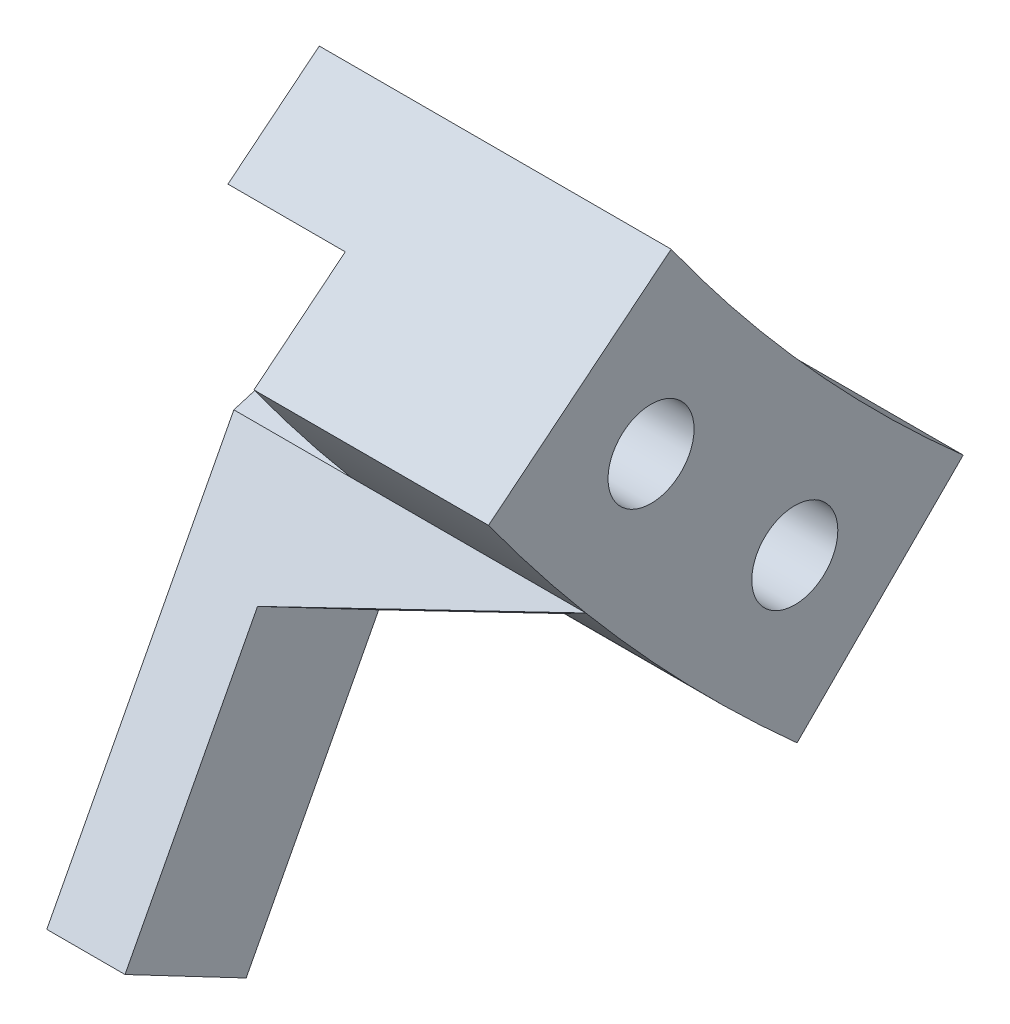
ISO-10303-21;
HEADER;
FILE_DESCRIPTION(('STEP AP214'),'2;1');
FILE_NAME('part.step','',(''),(''),'','','');
FILE_SCHEMA(('AUTOMOTIVE_DESIGN { 1 0 10303 214 1 1 1 1 }'));
ENDSEC;
DATA;
#1=APPLICATION_CONTEXT('core data for automotive mechanical design processes');
#2=APPLICATION_PROTOCOL_DEFINITION('international standard','automotive_design',2000,#1);
#3=PRODUCT_CONTEXT('',#1,'mechanical');
#4=PRODUCT('Part','Part','',(#3));
#5=PRODUCT_RELATED_PRODUCT_CATEGORY('part','',(#4));
#6=PRODUCT_DEFINITION_FORMATION('','',#4);
#7=PRODUCT_DEFINITION_CONTEXT('part definition',#1,'design');
#8=PRODUCT_DEFINITION('design','',#6,#7);
#9=PRODUCT_DEFINITION_SHAPE('','',#8);
#10=(LENGTH_UNIT() NAMED_UNIT(*) SI_UNIT(.MILLI.,.METRE.));
#11=(NAMED_UNIT(*) PLANE_ANGLE_UNIT() SI_UNIT($,.RADIAN.));
#12=(NAMED_UNIT(*) SI_UNIT($,.STERADIAN.) SOLID_ANGLE_UNIT());
#13=UNCERTAINTY_MEASURE_WITH_UNIT(LENGTH_MEASURE(1.E-05),#10,'distance_accuracy_value','');
#14=(GEOMETRIC_REPRESENTATION_CONTEXT(3) GLOBAL_UNCERTAINTY_ASSIGNED_CONTEXT((#13)) GLOBAL_UNIT_ASSIGNED_CONTEXT((#10,
#11,#12)) REPRESENTATION_CONTEXT('',''));
#15=CARTESIAN_POINT('',(0.,0.,0.));
#16=DIRECTION('',(0.,0.,1.));
#17=DIRECTION('',(1.,0.,0.));
#18=AXIS2_PLACEMENT_3D('',#15,#16,#17);
#19=CARTESIAN_POINT('',(9.,0.,0.));
#20=DIRECTION('',(-1.,0.,0.));
#21=DIRECTION('',(0.,0.,1.));
#22=AXIS2_PLACEMENT_3D('',#19,#20,#21);
#23=CYLINDRICAL_SURFACE('',#22,55.5);
#24=CARTESIAN_POINT('',(3.,0.,0.));
#25=DIRECTION('',(-1.,0.,0.));
#26=DIRECTION('',(0.,0.,1.));
#27=AXIS2_PLACEMENT_3D('',#24,#25,#26);
#28=CIRCLE('',#27,55.5);
#29=CARTESIAN_POINT('',(3.,-41.308371776399,37.0657310892798));
#30=VERTEX_POINT('',#29);
#31=CARTESIAN_POINT('',(3.,-38.5024405764329,39.9726415146442));
#32=VERTEX_POINT('',#31);
#33=EDGE_CURVE('E51',#30,#32,#28,.T.);
#34=ORIENTED_EDGE('',*,*,#33,.F.);
#35=DIRECTION('',(-1.,0.,0.));
#36=VECTOR('',#35,1.);
#37=CARTESIAN_POINT('',(9.,-41.308371776399,37.0657310892798));
#38=LINE('',#37,#36);
#39=CARTESIAN_POINT('',(9.,-41.308371776399,37.0657310892798));
#40=VERTEX_POINT('',#39);
#41=EDGE_CURVE('E165',#40,#30,#38,.T.);
#42=ORIENTED_EDGE('',*,*,#41,.F.);
#43=CARTESIAN_POINT('',(9.,0.,0.));
#44=DIRECTION('',(1.,0.,0.));
#45=DIRECTION('',(0.,0.,-1.));
#46=AXIS2_PLACEMENT_3D('',#43,#44,#45);
#47=CIRCLE('',#46,55.5);
#48=CARTESIAN_POINT('',(9.,-35.7290662565116,42.4697989686531));
#49=VERTEX_POINT('',#48);
#50=EDGE_CURVE('E250',#49,#40,#47,.T.);
#51=ORIENTED_EDGE('',*,*,#50,.F.);
#52=CARTESIAN_POINT('',(128.871806526806,0.,0.));
#53=DIRECTION('',(0.393919298579168,-0.813854070817419,0.427164064055968));
#54=DIRECTION('',(-0.919145030018058,-0.348794601778894,0.183070313166844));
#55=AXIS2_PLACEMENT_3D('',#52,#53,#54);
#56=ELLIPSE('',#55,140.891802458482,55.5);
#57=CARTESIAN_POINT('',(5.97799509234482,-38.5024405764329,39.9726415146442));
#58=VERTEX_POINT('',#57);
#59=EDGE_CURVE('E209',#49,#58,#56,.T.);
#60=ORIENTED_EDGE('',*,*,#59,.T.);
#61=DIRECTION('',(-1.,0.,0.));
#62=VECTOR('',#61,1.);
#63=CARTESIAN_POINT('',(2.,-38.5024405764329,39.9726415146442));
#64=LINE('',#63,#62);
#65=EDGE_CURVE('E168',#58,#32,#64,.T.);
#66=ORIENTED_EDGE('',*,*,#65,.T.);
#67=EDGE_LOOP('',(#34,#42,#51,#60,#66));
#68=FACE_BOUND('',#67,.T.);
#69=ADVANCED_FACE('F34',(#68),#23,.T.);
#70=CARTESIAN_POINT('',(3.,0.,0.));
#71=DIRECTION('',(-1.,0.,0.));
#72=DIRECTION('',(0.,0.,1.));
#73=AXIS2_PLACEMENT_3D('',#70,#71,#72);
#74=CIRCLE('',#73,55.5);
#75=CARTESIAN_POINT('',(3.,-35.7290662565116,42.469798968653));
#76=VERTEX_POINT('',#75);
#77=CARTESIAN_POINT('',(3.,-32.5447805142452,44.9565041042962));
#78=VERTEX_POINT('',#77);
#79=EDGE_CURVE('E314',#76,#78,#74,.T.);
#80=ORIENTED_EDGE('',*,*,#79,.F.);
#81=DIRECTION('',(-1.,0.,0.));
#82=VECTOR('',#81,1.);
#83=CARTESIAN_POINT('',(2.,-35.7290662565116,42.469798968653));
#84=LINE('',#83,#82);
#85=EDGE_CURVE('E232',#49,#76,#84,.T.);
#86=ORIENTED_EDGE('',*,*,#85,.F.);
#87=CARTESIAN_POINT('',(9.,-32.5447805142452,44.9565041042962));
#88=VERTEX_POINT('',#87);
#89=EDGE_CURVE('E251',#88,#49,#47,.T.);
#90=ORIENTED_EDGE('',*,*,#89,.F.);
#91=DIRECTION('',(-1.,0.,0.));
#92=VECTOR('',#91,1.);
#93=CARTESIAN_POINT('',(9.,-32.5447805142452,44.9565041042962));
#94=LINE('',#93,#92);
#95=EDGE_CURVE('E43',#88,#78,#94,.T.);
#96=ORIENTED_EDGE('',*,*,#95,.T.);
#97=EDGE_LOOP('',(#80,#86,#90,#96));
#98=FACE_BOUND('',#97,.T.);
#99=ADVANCED_FACE('F334',(#98),#23,.T.);
#100=CARTESIAN_POINT('',(9.,-33.0393205301164,40.800162976491));
#101=DIRECTION('',(-1.,0.,0.));
#102=DIRECTION('',(0.,0.,1.));
#103=AXIS2_PLACEMENT_3D('',#100,#101,#102);
#104=CYLINDRICAL_SURFACE('',#103,1.1);
#105=CARTESIAN_POINT('',(9.,-33.0393205301164,40.800162976491));
#106=DIRECTION('',(1.,0.,0.));
#107=DIRECTION('',(0.,0.,-1.));
#108=AXIS2_PLACEMENT_3D('',#105,#106,#107);
#109=CIRCLE('',#108,1.1);
#110=CARTESIAN_POINT('',(9.,-33.0393205301164,39.700162976491));
#111=VERTEX_POINT('',#110);
#112=EDGE_CURVE('E240',#111,#111,#109,.T.);
#113=ORIENTED_EDGE('',*,*,#112,.T.);
#114=EDGE_LOOP('',(#113));
#115=FACE_BOUND('',#114,.T.);
#116=CARTESIAN_POINT('',(3.,-33.0393205301164,40.800162976491));
#117=DIRECTION('',(-1.,0.,0.));
#118=DIRECTION('',(0.,0.,1.));
#119=AXIS2_PLACEMENT_3D('',#116,#117,#118);
#120=CIRCLE('',#119,1.1);
#121=CARTESIAN_POINT('',(3.,-33.0393205301164,41.900162976491));
#122=VERTEX_POINT('',#121);
#123=EDGE_CURVE('E38',#122,#122,#120,.T.);
#124=ORIENTED_EDGE('',*,*,#123,.T.);
#125=EDGE_LOOP('',(#124));
#126=FACE_BOUND('',#125,.T.);
#127=ADVANCED_FACE('F336',(#115,#126),#104,.F.);
#128=CARTESIAN_POINT('',(9.,-37.1231060122937,37.1231060122938));
#129=DIRECTION('',(-1.,0.,0.));
#130=DIRECTION('',(0.,0.,1.));
#131=AXIS2_PLACEMENT_3D('',#128,#129,#130);
#132=CYLINDRICAL_SURFACE('',#131,1.1);
#133=CARTESIAN_POINT('',(9.,-37.1231060122937,37.1231060122938));
#134=DIRECTION('',(1.,0.,0.));
#135=DIRECTION('',(0.,0.,-1.));
#136=AXIS2_PLACEMENT_3D('',#133,#134,#135);
#137=CIRCLE('',#136,1.1);
#138=CARTESIAN_POINT('',(9.,-37.1231060122937,36.0231060122938));
#139=VERTEX_POINT('',#138);
#140=EDGE_CURVE('E231',#139,#139,#137,.T.);
#141=ORIENTED_EDGE('',*,*,#140,.T.);
#142=EDGE_LOOP('',(#141));
#143=FACE_BOUND('',#142,.T.);
#144=CARTESIAN_POINT('',(3.,-37.1231060122937,37.1231060122938));
#145=DIRECTION('',(-1.,0.,0.));
#146=DIRECTION('',(0.,0.,1.));
#147=AXIS2_PLACEMENT_3D('',#144,#145,#146);
#148=CIRCLE('',#147,1.1);
#149=CARTESIAN_POINT('',(3.,-37.1231060122937,38.2231060122938));
#150=VERTEX_POINT('',#149);
#151=EDGE_CURVE('E181',#150,#150,#148,.T.);
#152=ORIENTED_EDGE('',*,*,#151,.T.);
#153=EDGE_LOOP('',(#152));
#154=FACE_BOUND('',#153,.T.);
#155=ADVANCED_FACE('F342',(#143,#154),#132,.F.);
#156=CARTESIAN_POINT('',(9.,0.,0.));
#157=DIRECTION('',(1.,0.,0.));
#158=DIRECTION('',(0.,0.,-1.));
#159=AXIS2_PLACEMENT_3D('',#156,#157,#158);
#160=PLANE('',#159);
#161=ORIENTED_EDGE('',*,*,#89,.T.);
#162=ORIENTED_EDGE('',*,*,#50,.T.);
#163=DIRECTION('',(0.,0.707106781186546,-0.707106781186549));
#164=VECTOR('',#163,1.);
#165=CARTESIAN_POINT('',(9.,-37.0587644401159,32.8161237529968));
#166=LINE('',#165,#164);
#167=CARTESIAN_POINT('',(9.,-37.0587644401159,32.8161237529968));
#168=VERTEX_POINT('',#167);
#169=EDGE_CURVE('E173',#40,#168,#166,.T.);
#170=ORIENTED_EDGE('',*,*,#169,.T.);
#171=CARTESIAN_POINT('',(9.,0.,0.));
#172=DIRECTION('',(-1.,0.,0.));
#173=DIRECTION('',(0.,0.,-1.));
#174=AXIS2_PLACEMENT_3D('',#171,#172,#173);
#175=CIRCLE('',#174,49.5);
#176=CARTESIAN_POINT('',(9.,-28.7626578959467,40.2859716372925));
#177=VERTEX_POINT('',#176);
#178=EDGE_CURVE('E244',#168,#177,#175,.T.);
#179=ORIENTED_EDGE('',*,*,#178,.T.);
#180=DIRECTION('',(0.,-0.629320391049836,0.777145961456972));
#181=VECTOR('',#180,1.);
#182=CARTESIAN_POINT('',(9.,-32.5447805142452,44.9565041042962));
#183=LINE('',#182,#181);
#184=EDGE_CURVE('E247',#177,#88,#183,.T.);
#185=ORIENTED_EDGE('',*,*,#184,.T.);
#186=EDGE_LOOP('',(#161,#162,#170,#179,#185));
#187=FACE_BOUND('',#186,.T.);
#188=ORIENTED_EDGE('',*,*,#112,.F.);
#189=EDGE_LOOP('',(#188));
#190=FACE_BOUND('',#189,.T.);
#191=ORIENTED_EDGE('',*,*,#140,.F.);
#192=EDGE_LOOP('',(#191));
#193=FACE_BOUND('',#192,.T.);
#194=ADVANCED_FACE('F277',(#187,#190,#193),#160,.T.);
#195=CARTESIAN_POINT('',(0.,0.,0.));
#196=DIRECTION('',(1.,0.,0.));
#197=DIRECTION('',(0.,0.,-1.));
#198=AXIS2_PLACEMENT_3D('',#195,#196,#197);
#199=PLANE('',#198);
#200=DIRECTION('',(0.,0.707106781186546,-0.707106781186549));
#201=VECTOR('',#200,1.);
#202=CARTESIAN_POINT('',(0.,-37.0587644401159,32.8161237529968));
#203=LINE('',#202,#201);
#204=CARTESIAN_POINT('',(0.,-39.1835681082574,34.9409274211383));
#205=VERTEX_POINT('',#204);
#206=CARTESIAN_POINT('',(0.,-37.0587644401159,32.8161237529968));
#207=VERTEX_POINT('',#206);
#208=EDGE_CURVE('E248',#205,#207,#203,.T.);
#209=ORIENTED_EDGE('',*,*,#208,.F.);
#210=DIRECTION('',(0.,-0.999205597903789,-0.0398518897636068));
#211=VECTOR('',#210,1.);
#212=CARTESIAN_POINT('',(0.,-39.1835681082574,34.9409274211383));
#213=LINE('',#212,#211);
#214=CARTESIAN_POINT('',(0.,-37.1231060122937,35.0231060122938));
#215=VERTEX_POINT('',#214);
#216=EDGE_CURVE('E159',#215,#205,#213,.T.);
#217=ORIENTED_EDGE('',*,*,#216,.F.);
#218=CARTESIAN_POINT('',(0.,-37.1231060122937,37.1231060122938));
#219=DIRECTION('',(-1.,0.,0.));
#220=DIRECTION('',(0.,0.,1.));
#221=AXIS2_PLACEMENT_3D('',#218,#219,#220);
#222=CIRCLE('',#221,2.1);
#223=CARTESIAN_POINT('',(0.,-36.3155551192554,39.0616264674743));
#224=VERTEX_POINT('',#223);
#225=EDGE_CURVE('E530',#224,#215,#222,.T.);
#226=ORIENTED_EDGE('',*,*,#225,.F.);
#227=DIRECTION('',(0.,0.923104978657367,-0.384548044303937));
#228=VECTOR('',#227,1.);
#229=CARTESIAN_POINT('',(0.,-36.3155551192554,39.0616264674743));
#230=LINE('',#229,#228);
#231=CARTESIAN_POINT('',(0.,-38.5024405764329,39.9726415146442));
#232=VERTEX_POINT('',#231);
#233=EDGE_CURVE('E532',#232,#224,#230,.T.);
#234=ORIENTED_EDGE('',*,*,#233,.F.);
#235=DIRECTION('',(0.,-0.885446849232737,0.46474065583271));
#236=VECTOR('',#235,1.);
#237=CARTESIAN_POINT('',(0.,-46.4714622195275,44.1553074171386));
#238=LINE('',#237,#236);
#239=CARTESIAN_POINT('',(0.,-46.4714622195275,44.1553074171386));
#240=VERTEX_POINT('',#239);
#241=EDGE_CURVE('E212',#232,#240,#238,.T.);
#242=ORIENTED_EDGE('',*,*,#241,.T.);
#243=DIRECTION('',(0.,0.464740655832709,0.885446849232738));
#244=VECTOR('',#243,1.);
#245=CARTESIAN_POINT('',(0.,-44.844869924113,47.2543713894531));
#246=LINE('',#245,#244);
#247=CARTESIAN_POINT('',(0.,-44.844869924113,47.2543713894531));
#248=VERTEX_POINT('',#247);
#249=EDGE_CURVE('E225',#240,#248,#246,.T.);
#250=ORIENTED_EDGE('',*,*,#249,.T.);
#251=DIRECTION('',(0.,0.885446849232738,-0.46474065583271));
#252=VECTOR('',#251,1.);
#253=CARTESIAN_POINT('',(0.,-35.7290662565116,42.469798968653));
#254=LINE('',#253,#252);
#255=CARTESIAN_POINT('',(0.,-35.7290662565116,42.469798968653));
#256=VERTEX_POINT('',#255);
#257=EDGE_CURVE('E216',#248,#256,#254,.T.);
#258=ORIENTED_EDGE('',*,*,#257,.T.);
#259=DIRECTION('',(0.,-0.285950705027522,0.958244329121891));
#260=VECTOR('',#259,1.);
#261=CARTESIAN_POINT('',(0.,-35.7290662565116,42.469798968653));
#262=LINE('',#261,#260);
#263=CARTESIAN_POINT('',(0.,-35.0516336212724,40.1996664959332));
#264=VERTEX_POINT('',#263);
#265=EDGE_CURVE('E321',#264,#256,#262,.T.);
#266=ORIENTED_EDGE('',*,*,#265,.F.);
#267=CARTESIAN_POINT('',(0.,-33.0393205301164,40.800162976491));
#268=DIRECTION('',(-1.,0.,0.));
#269=DIRECTION('',(0.,0.,1.));
#270=AXIS2_PLACEMENT_3D('',#267,#268,#269);
#271=CIRCLE('',#270,2.1);
#272=CARTESIAN_POINT('',(0.,-30.9393205301164,40.800162976491));
#273=VERTEX_POINT('',#272);
#274=EDGE_CURVE('E320',#273,#264,#271,.T.);
#275=ORIENTED_EDGE('',*,*,#274,.F.);
#276=DIRECTION('',(0.,-0.15493733397992,-0.987924300004406));
#277=VECTOR('',#276,1.);
#278=CARTESIAN_POINT('',(0.,-30.9393205301164,40.800162976491));
#279=LINE('',#278,#277);
#280=CARTESIAN_POINT('',(0.,-30.653719205096,42.6212378707943));
#281=VERTEX_POINT('',#280);
#282=EDGE_CURVE('E196',#281,#273,#279,.T.);
#283=ORIENTED_EDGE('',*,*,#282,.F.);
#284=DIRECTION('',(0.,-0.629320391049836,0.777145961456972));
#285=VECTOR('',#284,1.);
#286=CARTESIAN_POINT('',(0.,-32.5447805142452,44.9565041042962));
#287=LINE('',#286,#285);
#288=CARTESIAN_POINT('',(0.,-28.7626578959467,40.2859716372925));
#289=VERTEX_POINT('',#288);
#290=EDGE_CURVE('E257',#289,#281,#287,.T.);
#291=ORIENTED_EDGE('',*,*,#290,.F.);
#292=CARTESIAN_POINT('',(0.,0.,0.));
#293=DIRECTION('',(-1.,0.,0.));
#294=DIRECTION('',(0.,0.,-1.));
#295=AXIS2_PLACEMENT_3D('',#292,#293,#294);
#296=CIRCLE('',#295,49.5);
#297=EDGE_CURVE('E243',#207,#289,#296,.T.);
#298=ORIENTED_EDGE('',*,*,#297,.F.);
#299=EDGE_LOOP('',(#209,#217,#226,#234,#242,#250,#258,#266,#275,#283,#291,#298));
#300=FACE_BOUND('',#299,.T.);
#301=ADVANCED_FACE('F267',(#300),#199,.F.);
#302=CARTESIAN_POINT('',(9.,0.,0.));
#303=DIRECTION('',(-1.,0.,0.));
#304=DIRECTION('',(0.,0.,1.));
#305=AXIS2_PLACEMENT_3D('',#302,#303,#304);
#306=CYLINDRICAL_SURFACE('',#305,49.5);
#307=ORIENTED_EDGE('',*,*,#297,.T.);
#308=DIRECTION('',(-1.,0.,0.));
#309=VECTOR('',#308,1.);
#310=CARTESIAN_POINT('',(9.,-28.7626578959467,40.2859716372925));
#311=LINE('',#310,#309);
#312=EDGE_CURVE('E11',#177,#289,#311,.T.);
#313=ORIENTED_EDGE('',*,*,#312,.F.);
#314=ORIENTED_EDGE('',*,*,#178,.F.);
#315=DIRECTION('',(-1.,0.,0.));
#316=VECTOR('',#315,1.);
#317=CARTESIAN_POINT('',(9.,-37.0587644401159,32.8161237529968));
#318=LINE('',#317,#316);
#319=EDGE_CURVE('E174',#168,#207,#318,.T.);
#320=ORIENTED_EDGE('',*,*,#319,.T.);
#321=EDGE_LOOP('',(#307,#313,#314,#320));
#322=FACE_BOUND('',#321,.T.);
#323=ADVANCED_FACE('F36',(#322),#306,.F.);
#324=CARTESIAN_POINT('',(9.,-32.5447805142452,44.9565041042962));
#325=DIRECTION('',(0.,-0.777145961456972,-0.629320391049836));
#326=DIRECTION('',(0.,0.629320391049836,-0.777145961456972));
#327=AXIS2_PLACEMENT_3D('',#324,#325,#326);
#328=PLANE('',#327);
#329=ORIENTED_EDGE('',*,*,#290,.T.);
#330=DIRECTION('',(-1.,0.,0.));
#331=VECTOR('',#330,1.);
#332=CARTESIAN_POINT('',(3.,-30.653719205096,42.6212378707943));
#333=LINE('',#332,#331);
#334=CARTESIAN_POINT('',(3.,-30.653719205096,42.6212378707943));
#335=VERTEX_POINT('',#334);
#336=EDGE_CURVE('E187',#335,#281,#333,.T.);
#337=ORIENTED_EDGE('',*,*,#336,.F.);
#338=DIRECTION('',(0.,0.629320391049837,-0.777145961456972));
#339=VECTOR('',#338,1.);
#340=CARTESIAN_POINT('',(3.,-30.653719205096,42.6212378707943));
#341=LINE('',#340,#339);
#342=EDGE_CURVE('E316',#78,#335,#341,.T.);
#343=ORIENTED_EDGE('',*,*,#342,.F.);
#344=ORIENTED_EDGE('',*,*,#95,.F.);
#345=ORIENTED_EDGE('',*,*,#184,.F.);
#346=ORIENTED_EDGE('',*,*,#312,.T.);
#347=EDGE_LOOP('',(#329,#337,#343,#344,#345,#346));
#348=FACE_BOUND('',#347,.T.);
#349=ADVANCED_FACE('F272',(#348),#328,.F.);
#350=CARTESIAN_POINT('',(9.,-37.0587644401159,32.8161237529968));
#351=DIRECTION('',(0.,0.707106781186549,0.707106781186546));
#352=DIRECTION('',(0.,-0.707106781186546,0.707106781186549));
#353=AXIS2_PLACEMENT_3D('',#350,#351,#352);
#354=PLANE('',#353);
#355=DIRECTION('',(0.,-0.707106781186544,0.707106781186551));
#356=VECTOR('',#355,1.);
#357=CARTESIAN_POINT('',(3.,-41.308371776399,37.0657310892798));
#358=LINE('',#357,#356);
#359=CARTESIAN_POINT('',(3.,-39.1835681082574,34.9409274211383));
#360=VERTEX_POINT('',#359);
#361=EDGE_CURVE('E151',#360,#30,#358,.T.);
#362=ORIENTED_EDGE('',*,*,#361,.F.);
#363=DIRECTION('',(-1.,0.,0.));
#364=VECTOR('',#363,1.);
#365=CARTESIAN_POINT('',(3.,-39.1835681082574,34.9409274211383));
#366=LINE('',#365,#364);
#367=EDGE_CURVE('E261',#360,#205,#366,.T.);
#368=ORIENTED_EDGE('',*,*,#367,.T.);
#369=ORIENTED_EDGE('',*,*,#208,.T.);
#370=ORIENTED_EDGE('',*,*,#319,.F.);
#371=ORIENTED_EDGE('',*,*,#169,.F.);
#372=ORIENTED_EDGE('',*,*,#41,.T.);
#373=EDGE_LOOP('',(#362,#368,#369,#370,#371,#372));
#374=FACE_BOUND('',#373,.T.);
#375=ADVANCED_FACE('F171',(#374),#354,.F.);
#376=CARTESIAN_POINT('',(2.,-46.4714622195275,44.1553074171386));
#377=DIRECTION('',(0.,-0.46474065583271,-0.885446849232738));
#378=DIRECTION('',(0.,0.885446849232738,-0.46474065583271));
#379=AXIS2_PLACEMENT_3D('',#376,#377,#378);
#380=PLANE('',#379);
#381=ORIENTED_EDGE('',*,*,#241,.F.);
#382=DIRECTION('',(-1.,0.,0.));
#383=VECTOR('',#382,1.);
#384=CARTESIAN_POINT('',(3.,-38.5024405764329,39.9726415146442));
#385=LINE('',#384,#383);
#386=EDGE_CURVE('E296',#32,#232,#385,.T.);
#387=ORIENTED_EDGE('',*,*,#386,.F.);
#388=ORIENTED_EDGE('',*,*,#65,.F.);
#389=DIRECTION('',(0.919145030018058,0.348794601778894,-0.183070313166844));
#390=VECTOR('',#389,1.);
#391=CARTESIAN_POINT('',(2.,-40.0119990996243,40.7649569638366));
#392=LINE('',#391,#390);
#393=CARTESIAN_POINT('',(2.,-40.0119990996243,40.7649569638366));
#394=VERTEX_POINT('',#393);
#395=EDGE_CURVE('E206',#394,#58,#392,.T.);
#396=ORIENTED_EDGE('',*,*,#395,.F.);
#397=DIRECTION('',(0.,-0.885446849232737,0.46474065583271));
#398=VECTOR('',#397,1.);
#399=CARTESIAN_POINT('',(2.,-46.4714622195275,44.1553074171386));
#400=LINE('',#399,#398);
#401=CARTESIAN_POINT('',(2.,-46.4714622195275,44.1553074171386));
#402=VERTEX_POINT('',#401);
#403=EDGE_CURVE('E213',#394,#402,#400,.T.);
#404=ORIENTED_EDGE('',*,*,#403,.T.);
#405=DIRECTION('',(-1.,0.,0.));
#406=VECTOR('',#405,1.);
#407=CARTESIAN_POINT('',(2.,-46.4714622195275,44.1553074171386));
#408=LINE('',#407,#406);
#409=EDGE_CURVE('E222',#402,#240,#408,.T.);
#410=ORIENTED_EDGE('',*,*,#409,.T.);
#411=EDGE_LOOP('',(#381,#387,#388,#396,#404,#410));
#412=FACE_BOUND('',#411,.T.);
#413=ADVANCED_FACE('F294',(#412),#380,.T.);
#414=CARTESIAN_POINT('',(2.,-35.7290662565116,42.469798968653));
#415=DIRECTION('',(0.,0.46474065583271,0.885446849232738));
#416=DIRECTION('',(0.,-0.885446849232738,0.46474065583271));
#417=AXIS2_PLACEMENT_3D('',#414,#415,#416);
#418=PLANE('',#417);
#419=ORIENTED_EDGE('',*,*,#257,.F.);
#420=DIRECTION('',(-1.,0.,0.));
#421=VECTOR('',#420,1.);
#422=CARTESIAN_POINT('',(2.,-44.844869924113,47.2543713894531));
#423=LINE('',#422,#421);
#424=CARTESIAN_POINT('',(2.,-44.844869924113,47.2543713894531));
#425=VERTEX_POINT('',#424);
#426=EDGE_CURVE('E235',#425,#248,#423,.T.);
#427=ORIENTED_EDGE('',*,*,#426,.F.);
#428=DIRECTION('',(0.,0.885446849232738,-0.46474065583271));
#429=VECTOR('',#428,1.);
#430=CARTESIAN_POINT('',(2.,-35.7290662565116,42.469798968653));
#431=LINE('',#430,#429);
#432=CARTESIAN_POINT('',(2.,-38.3854068042098,43.8640209361512));
#433=VERTEX_POINT('',#432);
#434=EDGE_CURVE('E219',#425,#433,#431,.T.);
#435=ORIENTED_EDGE('',*,*,#434,.T.);
#436=DIRECTION('',(0.919145030018058,0.348794601778894,-0.183070313166844));
#437=VECTOR('',#436,1.);
#438=CARTESIAN_POINT('',(2.,-38.3854068042098,43.8640209361512));
#439=LINE('',#438,#437);
#440=EDGE_CURVE('E59',#433,#49,#439,.T.);
#441=ORIENTED_EDGE('',*,*,#440,.T.);
#442=ORIENTED_EDGE('',*,*,#85,.T.);
#443=DIRECTION('',(-1.,0.,0.));
#444=VECTOR('',#443,1.);
#445=CARTESIAN_POINT('',(3.,-35.7290662565116,42.469798968653));
#446=LINE('',#445,#444);
#447=EDGE_CURVE('E193',#76,#256,#446,.T.);
#448=ORIENTED_EDGE('',*,*,#447,.T.);
#449=EDGE_LOOP('',(#419,#427,#435,#441,#442,#448));
#450=FACE_BOUND('',#449,.T.);
#451=ADVANCED_FACE('F282',(#450),#418,.T.);
#452=CARTESIAN_POINT('',(2.,-44.844869924113,47.2543713894531));
#453=DIRECTION('',(0.,-0.885446849232738,0.464740655832709));
#454=DIRECTION('',(0.,-0.464740655832709,-0.885446849232738));
#455=AXIS2_PLACEMENT_3D('',#452,#453,#454);
#456=PLANE('',#455);
#457=ORIENTED_EDGE('',*,*,#249,.F.);
#458=ORIENTED_EDGE('',*,*,#409,.F.);
#459=DIRECTION('',(0.,0.464740655832709,0.885446849232738));
#460=VECTOR('',#459,1.);
#461=CARTESIAN_POINT('',(2.,-44.844869924113,47.2543713894531));
#462=LINE('',#461,#460);
#463=EDGE_CURVE('E215',#402,#425,#462,.T.);
#464=ORIENTED_EDGE('',*,*,#463,.T.);
#465=ORIENTED_EDGE('',*,*,#426,.T.);
#466=EDGE_LOOP('',(#457,#458,#464,#465));
#467=FACE_BOUND('',#466,.T.);
#468=ADVANCED_FACE('F291',(#467),#456,.T.);
#469=CARTESIAN_POINT('',(2.,0.,0.));
#470=DIRECTION('',(-1.,0.,0.));
#471=DIRECTION('',(0.,0.,1.));
#472=AXIS2_PLACEMENT_3D('',#469,#470,#471);
#473=PLANE('',#472);
#474=ORIENTED_EDGE('',*,*,#403,.F.);
#475=DIRECTION('',(0.,0.46474065583271,0.885446849232738));
#476=VECTOR('',#475,1.);
#477=CARTESIAN_POINT('',(2.,-43.5513584875166,34.021594662778));
#478=LINE('',#477,#476);
#479=EDGE_CURVE('E205',#394,#433,#478,.T.);
#480=ORIENTED_EDGE('',*,*,#479,.T.);
#481=ORIENTED_EDGE('',*,*,#434,.F.);
#482=ORIENTED_EDGE('',*,*,#463,.F.);
#483=EDGE_LOOP('',(#474,#480,#481,#482));
#484=FACE_BOUND('',#483,.T.);
#485=ADVANCED_FACE('F287',(#484),#473,.F.);
#486=CARTESIAN_POINT('',(2.,-43.5513584875166,34.021594662778));
#487=DIRECTION('',(0.393919298579168,-0.813854070817419,0.427164064055968));
#488=DIRECTION('',(0.,-0.46474065583271,-0.885446849232738));
#489=AXIS2_PLACEMENT_3D('',#486,#487,#488);
#490=PLANE('',#489);
#491=ORIENTED_EDGE('',*,*,#59,.F.);
#492=ORIENTED_EDGE('',*,*,#440,.F.);
#493=ORIENTED_EDGE('',*,*,#479,.F.);
#494=ORIENTED_EDGE('',*,*,#395,.T.);
#495=EDGE_LOOP('',(#491,#492,#493,#494));
#496=FACE_BOUND('',#495,.T.);
#497=ADVANCED_FACE('F279',(#496),#490,.T.);
#498=CARTESIAN_POINT('',(3.,-33.0393205301164,40.800162976491));
#499=DIRECTION('',(-1.,0.,0.));
#500=DIRECTION('',(0.,0.,1.));
#501=AXIS2_PLACEMENT_3D('',#498,#499,#500);
#502=CYLINDRICAL_SURFACE('',#501,2.1);
#503=ORIENTED_EDGE('',*,*,#274,.T.);
#504=DIRECTION('',(-1.,0.,0.));
#505=VECTOR('',#504,1.);
#506=CARTESIAN_POINT('',(3.,-35.0516336212724,40.1996664959332));
#507=LINE('',#506,#505);
#508=CARTESIAN_POINT('',(3.,-35.0516336212724,40.1996664959332));
#509=VERTEX_POINT('',#508);
#510=EDGE_CURVE('E201',#509,#264,#507,.T.);
#511=ORIENTED_EDGE('',*,*,#510,.F.);
#512=CARTESIAN_POINT('',(3.,-33.0393205301164,40.800162976491));
#513=DIRECTION('',(-1.,0.,0.));
#514=DIRECTION('',(0.,0.,1.));
#515=AXIS2_PLACEMENT_3D('',#512,#513,#514);
#516=CIRCLE('',#515,2.1);
#517=CARTESIAN_POINT('',(3.,-30.9393205301164,40.800162976491));
#518=VERTEX_POINT('',#517);
#519=EDGE_CURVE('E308',#518,#509,#516,.T.);
#520=ORIENTED_EDGE('',*,*,#519,.F.);
#521=DIRECTION('',(-1.,0.,0.));
#522=VECTOR('',#521,1.);
#523=CARTESIAN_POINT('',(3.,-30.9393205301164,40.800162976491));
#524=LINE('',#523,#522);
#525=EDGE_CURVE('E183',#518,#273,#524,.T.);
#526=ORIENTED_EDGE('',*,*,#525,.T.);
#527=EDGE_LOOP('',(#503,#511,#520,#526));
#528=FACE_BOUND('',#527,.T.);
#529=ADVANCED_FACE('F327',(#528),#502,.F.);
#530=CARTESIAN_POINT('',(3.,-30.9393205301164,40.800162976491));
#531=DIRECTION('',(0.,0.987924300004405,-0.15493733397992));
#532=DIRECTION('',(0.,0.15493733397992,0.987924300004406));
#533=AXIS2_PLACEMENT_3D('',#530,#531,#532);
#534=PLANE('',#533);
#535=ORIENTED_EDGE('',*,*,#282,.T.);
#536=ORIENTED_EDGE('',*,*,#525,.F.);
#537=DIRECTION('',(0.,-0.15493733397992,-0.987924300004406));
#538=VECTOR('',#537,1.);
#539=CARTESIAN_POINT('',(3.,-30.9393205301164,40.800162976491));
#540=LINE('',#539,#538);
#541=EDGE_CURVE('E203',#335,#518,#540,.T.);
#542=ORIENTED_EDGE('',*,*,#541,.F.);
#543=ORIENTED_EDGE('',*,*,#336,.T.);
#544=EDGE_LOOP('',(#535,#536,#542,#543));
#545=FACE_BOUND('',#544,.T.);
#546=ADVANCED_FACE('F325',(#545),#534,.F.);
#547=CARTESIAN_POINT('',(3.,-35.7290662565116,42.469798968653));
#548=DIRECTION('',(0.,-0.958244329121891,-0.285950705027522));
#549=DIRECTION('',(0.,0.285950705027522,-0.958244329121891));
#550=AXIS2_PLACEMENT_3D('',#547,#548,#549);
#551=PLANE('',#550);
#552=ORIENTED_EDGE('',*,*,#265,.T.);
#553=ORIENTED_EDGE('',*,*,#447,.F.);
#554=DIRECTION('',(0.,-0.285950705027522,0.958244329121891));
#555=VECTOR('',#554,1.);
#556=CARTESIAN_POINT('',(3.,-35.7290662565116,42.469798968653));
#557=LINE('',#556,#555);
#558=EDGE_CURVE('E311',#509,#76,#557,.T.);
#559=ORIENTED_EDGE('',*,*,#558,.F.);
#560=ORIENTED_EDGE('',*,*,#510,.T.);
#561=EDGE_LOOP('',(#552,#553,#559,#560));
#562=FACE_BOUND('',#561,.T.);
#563=ADVANCED_FACE('F329',(#562),#551,.F.);
#564=CARTESIAN_POINT('',(3.,-33.0393205301164,40.800162976491));
#565=DIRECTION('',(-1.,0.,0.));
#566=DIRECTION('',(0.,0.,1.));
#567=AXIS2_PLACEMENT_3D('',#564,#565,#566);
#568=PLANE('',#567);
#569=ORIENTED_EDGE('',*,*,#123,.F.);
#570=EDGE_LOOP('',(#569));
#571=FACE_BOUND('',#570,.T.);
#572=ORIENTED_EDGE('',*,*,#519,.T.);
#573=ORIENTED_EDGE('',*,*,#558,.T.);
#574=ORIENTED_EDGE('',*,*,#79,.T.);
#575=ORIENTED_EDGE('',*,*,#342,.T.);
#576=ORIENTED_EDGE('',*,*,#541,.T.);
#577=EDGE_LOOP('',(#572,#573,#574,#575,#576));
#578=FACE_BOUND('',#577,.T.);
#579=ADVANCED_FACE('F332',(#571,#578),#568,.T.);
#580=CARTESIAN_POINT('',(3.,-39.1835681082574,34.9409274211383));
#581=DIRECTION('',(0.,0.0398518897636068,-0.999205597903789));
#582=DIRECTION('',(0.,0.99920559790379,0.0398518897636068));
#583=AXIS2_PLACEMENT_3D('',#580,#581,#582);
#584=PLANE('',#583);
#585=ORIENTED_EDGE('',*,*,#216,.T.);
#586=ORIENTED_EDGE('',*,*,#367,.F.);
#587=DIRECTION('',(0.,-0.999205597903789,-0.0398518897636068));
#588=VECTOR('',#587,1.);
#589=CARTESIAN_POINT('',(3.,-39.1835681082574,34.9409274211383));
#590=LINE('',#589,#588);
#591=CARTESIAN_POINT('',(3.,-37.1231060122937,35.0231060122938));
#592=VERTEX_POINT('',#591);
#593=EDGE_CURVE('E155',#592,#360,#590,.T.);
#594=ORIENTED_EDGE('',*,*,#593,.F.);
#595=DIRECTION('',(-1.,0.,0.));
#596=VECTOR('',#595,1.);
#597=CARTESIAN_POINT('',(3.,-37.1231060122937,35.0231060122938));
#598=LINE('',#597,#596);
#599=EDGE_CURVE('E302',#592,#215,#598,.T.);
#600=ORIENTED_EDGE('',*,*,#599,.T.);
#601=EDGE_LOOP('',(#585,#586,#594,#600));
#602=FACE_BOUND('',#601,.T.);
#603=ADVANCED_FACE('F381',(#602),#584,.F.);
#604=CARTESIAN_POINT('',(3.,-37.1231060122937,37.1231060122938));
#605=DIRECTION('',(-1.,0.,0.));
#606=DIRECTION('',(0.,0.,1.));
#607=AXIS2_PLACEMENT_3D('',#604,#605,#606);
#608=CYLINDRICAL_SURFACE('',#607,2.1);
#609=ORIENTED_EDGE('',*,*,#225,.T.);
#610=ORIENTED_EDGE('',*,*,#599,.F.);
#611=CARTESIAN_POINT('',(3.,-37.1231060122937,37.1231060122938));
#612=DIRECTION('',(-1.,0.,0.));
#613=DIRECTION('',(0.,0.,1.));
#614=AXIS2_PLACEMENT_3D('',#611,#612,#613);
#615=CIRCLE('',#614,2.1);
#616=CARTESIAN_POINT('',(3.,-36.3155551192554,39.0616264674743));
#617=VERTEX_POINT('',#616);
#618=EDGE_CURVE('E304',#617,#592,#615,.T.);
#619=ORIENTED_EDGE('',*,*,#618,.F.);
#620=DIRECTION('',(-1.,0.,0.));
#621=VECTOR('',#620,1.);
#622=CARTESIAN_POINT('',(3.,-36.3155551192554,39.0616264674743));
#623=LINE('',#622,#621);
#624=EDGE_CURVE('E300',#617,#224,#623,.T.);
#625=ORIENTED_EDGE('',*,*,#624,.T.);
#626=EDGE_LOOP('',(#609,#610,#619,#625));
#627=FACE_BOUND('',#626,.T.);
#628=ADVANCED_FACE('F386',(#627),#608,.F.);
#629=CARTESIAN_POINT('',(3.,-36.3155551192554,39.0616264674743));
#630=DIRECTION('',(0.,0.384548044303937,0.923104978657367));
#631=DIRECTION('',(0.,-0.923104978657367,0.384548044303937));
#632=AXIS2_PLACEMENT_3D('',#629,#630,#631);
#633=PLANE('',#632);
#634=ORIENTED_EDGE('',*,*,#233,.T.);
#635=ORIENTED_EDGE('',*,*,#624,.F.);
#636=DIRECTION('',(0.,0.923104978657367,-0.384548044303937));
#637=VECTOR('',#636,1.);
#638=CARTESIAN_POINT('',(3.,-36.3155551192554,39.0616264674743));
#639=LINE('',#638,#637);
#640=EDGE_CURVE('E169',#32,#617,#639,.T.);
#641=ORIENTED_EDGE('',*,*,#640,.F.);
#642=ORIENTED_EDGE('',*,*,#386,.T.);
#643=EDGE_LOOP('',(#634,#635,#641,#642));
#644=FACE_BOUND('',#643,.T.);
#645=ADVANCED_FACE('F383',(#644),#633,.F.);
#646=CARTESIAN_POINT('',(3.,-37.1231060122937,37.1231060122938));
#647=DIRECTION('',(-1.,0.,0.));
#648=DIRECTION('',(0.,0.,1.));
#649=AXIS2_PLACEMENT_3D('',#646,#647,#648);
#650=PLANE('',#649);
#651=ORIENTED_EDGE('',*,*,#151,.F.);
#652=EDGE_LOOP('',(#651));
#653=FACE_BOUND('',#652,.T.);
#654=ORIENTED_EDGE('',*,*,#361,.T.);
#655=ORIENTED_EDGE('',*,*,#33,.T.);
#656=ORIENTED_EDGE('',*,*,#640,.T.);
#657=ORIENTED_EDGE('',*,*,#618,.T.);
#658=ORIENTED_EDGE('',*,*,#593,.T.);
#659=EDGE_LOOP('',(#654,#655,#656,#657,#658));
#660=FACE_BOUND('',#659,.T.);
#661=ADVANCED_FACE('F152',(#653,#660),#650,.T.);
#662=CLOSED_SHELL('',(#69,#99,#127,#155,#194,#301,#323,#349,#375,#413,#451,#468,#485,#497,#529,
#546,#563,#579,#603,#628,#645,#661));
#663=MANIFOLD_SOLID_BREP('B2',#662);
#664=ADVANCED_BREP_SHAPE_REPRESENTATION('',(#18,#663),#14);
#665=SHAPE_DEFINITION_REPRESENTATION(#9,#664);
ENDSEC;
END-ISO-10303-21;
